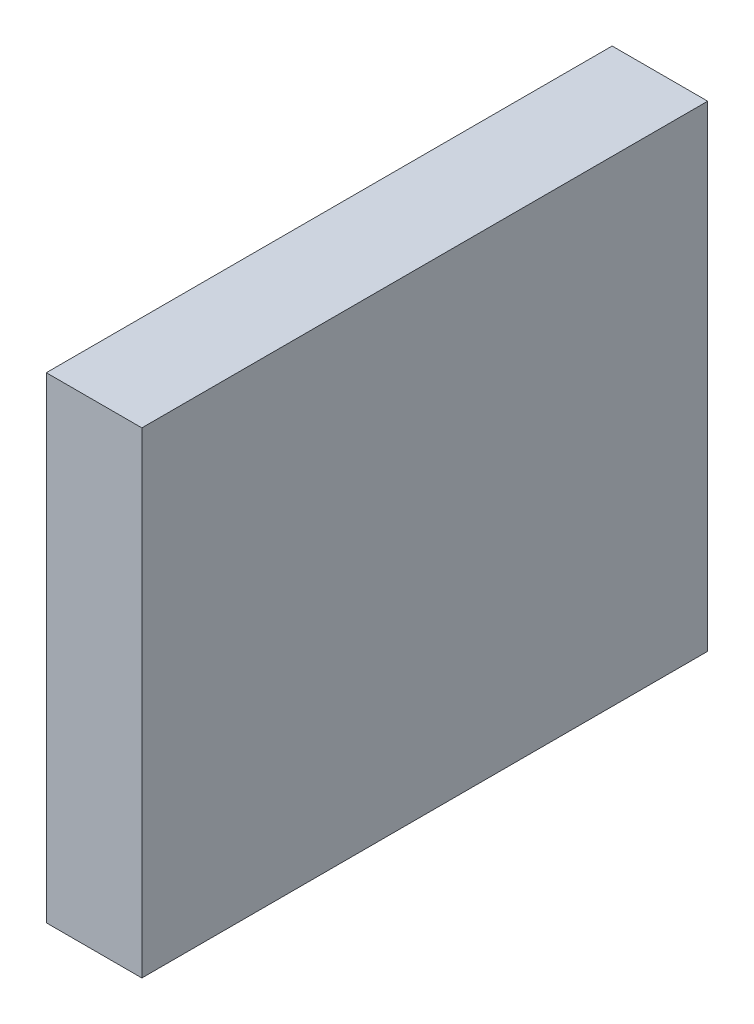
ISO-10303-21;
HEADER;
FILE_DESCRIPTION(('STEP AP214'),'2;1');
FILE_NAME('part.step','',(''),(''),'','','');
FILE_SCHEMA(('AUTOMOTIVE_DESIGN { 1 0 10303 214 1 1 1 1 }'));
ENDSEC;
DATA;
#1=APPLICATION_CONTEXT('core data for automotive mechanical design processes');
#2=APPLICATION_PROTOCOL_DEFINITION('international standard','automotive_design',2000,#1);
#3=PRODUCT_CONTEXT('',#1,'mechanical');
#4=PRODUCT('Part','Part','',(#3));
#5=PRODUCT_RELATED_PRODUCT_CATEGORY('part','',(#4));
#6=PRODUCT_DEFINITION_FORMATION('','',#4);
#7=PRODUCT_DEFINITION_CONTEXT('part definition',#1,'design');
#8=PRODUCT_DEFINITION('design','',#6,#7);
#9=PRODUCT_DEFINITION_SHAPE('','',#8);
#10=(LENGTH_UNIT() NAMED_UNIT(*) SI_UNIT(.MILLI.,.METRE.));
#11=(NAMED_UNIT(*) PLANE_ANGLE_UNIT() SI_UNIT($,.RADIAN.));
#12=(NAMED_UNIT(*) SI_UNIT($,.STERADIAN.) SOLID_ANGLE_UNIT());
#13=UNCERTAINTY_MEASURE_WITH_UNIT(LENGTH_MEASURE(1.E-05),#10,'distance_accuracy_value','');
#14=(GEOMETRIC_REPRESENTATION_CONTEXT(3) GLOBAL_UNCERTAINTY_ASSIGNED_CONTEXT((#13)) GLOBAL_UNIT_ASSIGNED_CONTEXT((#10,
#11,#12)) REPRESENTATION_CONTEXT('',''));
#15=CARTESIAN_POINT('',(0.,0.,0.));
#16=DIRECTION('',(0.,0.,1.));
#17=DIRECTION('',(1.,0.,0.));
#18=AXIS2_PLACEMENT_3D('',#15,#16,#17);
#19=CARTESIAN_POINT('',(3.57,8.9,-10.57));
#20=DIRECTION('',(0.,0.,-1.));
#21=DIRECTION('',(-1.,0.,0.));
#22=AXIS2_PLACEMENT_3D('',#19,#20,#21);
#23=PLANE('',#22);
#24=DIRECTION('',(0.,-1.,0.));
#25=VECTOR('',#24,1.);
#26=CARTESIAN_POINT('',(0.,8.9,-10.57));
#27=LINE('',#26,#25);
#28=CARTESIAN_POINT('',(0.,8.9,-10.57));
#29=VERTEX_POINT('',#28);
#30=CARTESIAN_POINT('',(0.,-8.9,-10.57));
#31=VERTEX_POINT('',#30);
#32=EDGE_CURVE('E116',#29,#31,#27,.T.);
#33=ORIENTED_EDGE('',*,*,#32,.F.);
#34=DIRECTION('',(-1.,0.,0.));
#35=VECTOR('',#34,1.);
#36=CARTESIAN_POINT('',(3.57,8.9,-10.57));
#37=LINE('',#36,#35);
#38=CARTESIAN_POINT('',(3.57,8.9,-10.57));
#39=VERTEX_POINT('',#38);
#40=EDGE_CURVE('E11',#39,#29,#37,.T.);
#41=ORIENTED_EDGE('',*,*,#40,.F.);
#42=DIRECTION('',(0.,-1.,0.));
#43=VECTOR('',#42,1.);
#44=CARTESIAN_POINT('',(3.57,8.9,-10.57));
#45=LINE('',#44,#43);
#46=CARTESIAN_POINT('',(3.57,-8.9,-10.57));
#47=VERTEX_POINT('',#46);
#48=EDGE_CURVE('E109',#39,#47,#45,.T.);
#49=ORIENTED_EDGE('',*,*,#48,.T.);
#50=DIRECTION('',(-1.,0.,0.));
#51=VECTOR('',#50,1.);
#52=CARTESIAN_POINT('',(3.57,-8.9,-10.57));
#53=LINE('',#52,#51);
#54=EDGE_CURVE('E48',#47,#31,#53,.T.);
#55=ORIENTED_EDGE('',*,*,#54,.T.);
#56=EDGE_LOOP('',(#33,#41,#49,#55));
#57=FACE_BOUND('',#56,.T.);
#58=ADVANCED_FACE('F45',(#57),#23,.T.);
#59=CARTESIAN_POINT('',(3.57,8.9,-10.57));
#60=DIRECTION('',(0.,-1.,0.));
#61=DIRECTION('',(0.,0.,-1.));
#62=AXIS2_PLACEMENT_3D('',#59,#60,#61);
#63=PLANE('',#62);
#64=DIRECTION('',(0.,0.,1.));
#65=VECTOR('',#64,1.);
#66=CARTESIAN_POINT('',(0.,8.9,-10.57));
#67=LINE('',#66,#65);
#68=CARTESIAN_POINT('',(0.,8.9,10.57));
#69=VERTEX_POINT('',#68);
#70=EDGE_CURVE('E79',#29,#69,#67,.T.);
#71=ORIENTED_EDGE('',*,*,#70,.T.);
#72=DIRECTION('',(-1.,0.,0.));
#73=VECTOR('',#72,1.);
#74=CARTESIAN_POINT('',(3.57,8.9,10.57));
#75=LINE('',#74,#73);
#76=CARTESIAN_POINT('',(3.57,8.9,10.57));
#77=VERTEX_POINT('',#76);
#78=EDGE_CURVE('E55',#77,#69,#75,.T.);
#79=ORIENTED_EDGE('',*,*,#78,.F.);
#80=DIRECTION('',(0.,0.,1.));
#81=VECTOR('',#80,1.);
#82=CARTESIAN_POINT('',(3.57,8.9,-10.57));
#83=LINE('',#82,#81);
#84=EDGE_CURVE('E96',#39,#77,#83,.T.);
#85=ORIENTED_EDGE('',*,*,#84,.F.);
#86=ORIENTED_EDGE('',*,*,#40,.T.);
#87=EDGE_LOOP('',(#71,#79,#85,#86));
#88=FACE_BOUND('',#87,.T.);
#89=ADVANCED_FACE('F132',(#88),#63,.F.);
#90=CARTESIAN_POINT('',(3.57,8.9,10.57));
#91=DIRECTION('',(0.,0.,-1.));
#92=DIRECTION('',(0.,1.,0.));
#93=AXIS2_PLACEMENT_3D('',#90,#91,#92);
#94=PLANE('',#93);
#95=DIRECTION('',(0.,-1.,0.));
#96=VECTOR('',#95,1.);
#97=CARTESIAN_POINT('',(0.,8.9,10.57));
#98=LINE('',#97,#96);
#99=CARTESIAN_POINT('',(0.,-8.9,10.57));
#100=VERTEX_POINT('',#99);
#101=EDGE_CURVE('E104',#69,#100,#98,.T.);
#102=ORIENTED_EDGE('',*,*,#101,.T.);
#103=DIRECTION('',(-1.,0.,0.));
#104=VECTOR('',#103,1.);
#105=CARTESIAN_POINT('',(3.57,-8.9,10.57));
#106=LINE('',#105,#104);
#107=CARTESIAN_POINT('',(3.57,-8.9,10.57));
#108=VERTEX_POINT('',#107);
#109=EDGE_CURVE('E101',#108,#100,#106,.T.);
#110=ORIENTED_EDGE('',*,*,#109,.F.);
#111=DIRECTION('',(0.,-1.,0.));
#112=VECTOR('',#111,1.);
#113=CARTESIAN_POINT('',(3.57,8.9,10.57));
#114=LINE('',#113,#112);
#115=EDGE_CURVE('E91',#77,#108,#114,.T.);
#116=ORIENTED_EDGE('',*,*,#115,.F.);
#117=ORIENTED_EDGE('',*,*,#78,.T.);
#118=EDGE_LOOP('',(#102,#110,#116,#117));
#119=FACE_BOUND('',#118,.T.);
#120=ADVANCED_FACE('F102',(#119),#94,.F.);
#121=CARTESIAN_POINT('',(3.57,-8.9,-10.57));
#122=DIRECTION('',(0.,-1.,0.));
#123=DIRECTION('',(0.,0.,-1.));
#124=AXIS2_PLACEMENT_3D('',#121,#122,#123);
#125=PLANE('',#124);
#126=DIRECTION('',(0.,0.,1.));
#127=VECTOR('',#126,1.);
#128=CARTESIAN_POINT('',(0.,-8.9,-10.57));
#129=LINE('',#128,#127);
#130=EDGE_CURVE('E120',#31,#100,#129,.T.);
#131=ORIENTED_EDGE('',*,*,#130,.F.);
#132=ORIENTED_EDGE('',*,*,#54,.F.);
#133=DIRECTION('',(0.,0.,1.));
#134=VECTOR('',#133,1.);
#135=CARTESIAN_POINT('',(3.57,-8.9,-10.57));
#136=LINE('',#135,#134);
#137=EDGE_CURVE('E95',#47,#108,#136,.T.);
#138=ORIENTED_EDGE('',*,*,#137,.T.);
#139=ORIENTED_EDGE('',*,*,#109,.T.);
#140=EDGE_LOOP('',(#131,#132,#138,#139));
#141=FACE_BOUND('',#140,.T.);
#142=ADVANCED_FACE('F107',(#141),#125,.T.);
#143=CARTESIAN_POINT('',(3.57,0.,0.));
#144=DIRECTION('',(-1.,0.,0.));
#145=DIRECTION('',(0.,0.,1.));
#146=AXIS2_PLACEMENT_3D('',#143,#144,#145);
#147=PLANE('',#146);
#148=ORIENTED_EDGE('',*,*,#48,.F.);
#149=ORIENTED_EDGE('',*,*,#84,.T.);
#150=ORIENTED_EDGE('',*,*,#115,.T.);
#151=ORIENTED_EDGE('',*,*,#137,.F.);
#152=EDGE_LOOP('',(#148,#149,#150,#151));
#153=FACE_BOUND('',#152,.T.);
#154=ADVANCED_FACE('F94',(#153),#147,.F.);
#155=CARTESIAN_POINT('',(0.,0.,0.));
#156=DIRECTION('',(-1.,0.,0.));
#157=DIRECTION('',(0.,0.,1.));
#158=AXIS2_PLACEMENT_3D('',#155,#156,#157);
#159=PLANE('',#158);
#160=ORIENTED_EDGE('',*,*,#32,.T.);
#161=ORIENTED_EDGE('',*,*,#130,.T.);
#162=ORIENTED_EDGE('',*,*,#101,.F.);
#163=ORIENTED_EDGE('',*,*,#70,.F.);
#164=EDGE_LOOP('',(#160,#161,#162,#163));
#165=FACE_BOUND('',#164,.T.);
#166=ADVANCED_FACE('F129',(#165),#159,.T.);
#167=CLOSED_SHELL('',(#58,#89,#120,#142,#154,#166));
#168=MANIFOLD_SOLID_BREP('B2',#167);
#169=ADVANCED_BREP_SHAPE_REPRESENTATION('',(#18,#168),#14);
#170=SHAPE_DEFINITION_REPRESENTATION(#9,#169);
ENDSEC;
END-ISO-10303-21;
